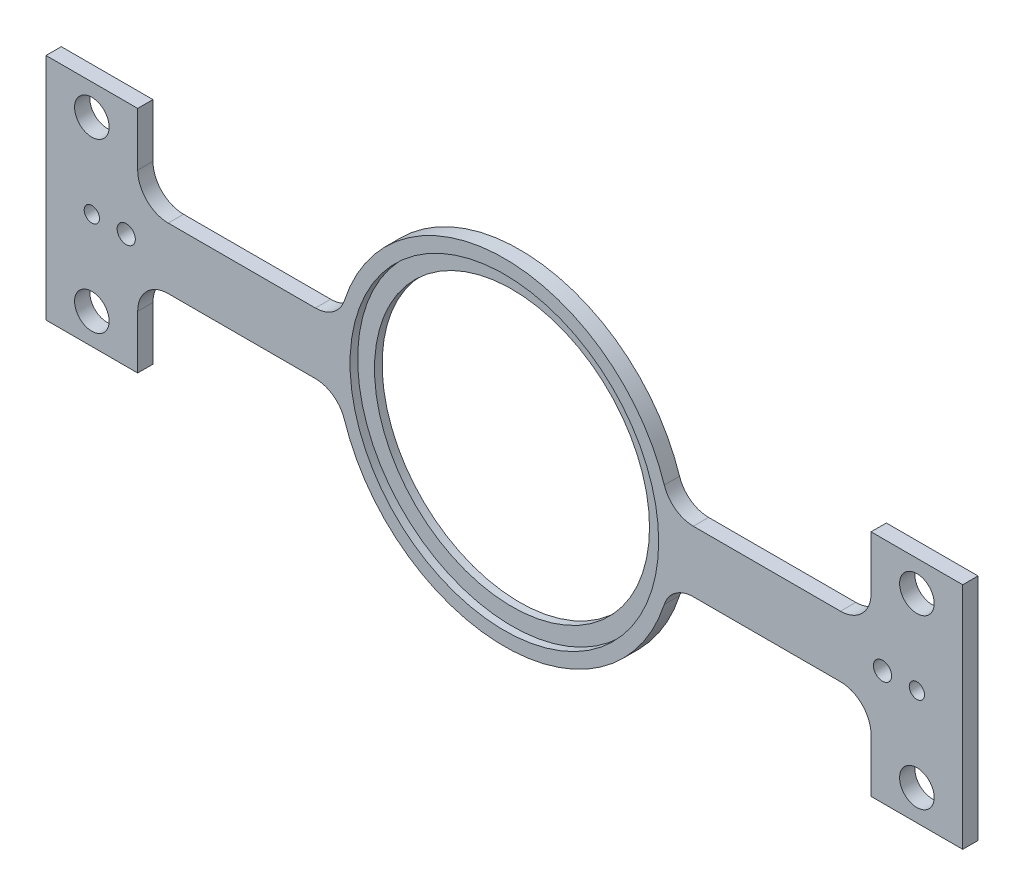
ISO-10303-21;
HEADER;
FILE_DESCRIPTION(('STEP AP214'),'2;1');
FILE_NAME('part.step','',(''),(''),'','','');
FILE_SCHEMA(('AUTOMOTIVE_DESIGN { 1 0 10303 214 1 1 1 1 }'));
ENDSEC;
DATA;
#1=APPLICATION_CONTEXT('core data for automotive mechanical design processes');
#2=APPLICATION_PROTOCOL_DEFINITION('international standard','automotive_design',2000,#1);
#3=PRODUCT_CONTEXT('',#1,'mechanical');
#4=PRODUCT('Part','Part','',(#3));
#5=PRODUCT_RELATED_PRODUCT_CATEGORY('part','',(#4));
#6=PRODUCT_DEFINITION_FORMATION('','',#4);
#7=PRODUCT_DEFINITION_CONTEXT('part definition',#1,'design');
#8=PRODUCT_DEFINITION('design','',#6,#7);
#9=PRODUCT_DEFINITION_SHAPE('','',#8);
#10=(LENGTH_UNIT() NAMED_UNIT(*) SI_UNIT(.MILLI.,.METRE.));
#11=(NAMED_UNIT(*) PLANE_ANGLE_UNIT() SI_UNIT($,.RADIAN.));
#12=(NAMED_UNIT(*) SI_UNIT($,.STERADIAN.) SOLID_ANGLE_UNIT());
#13=UNCERTAINTY_MEASURE_WITH_UNIT(LENGTH_MEASURE(1.E-05),#10,'distance_accuracy_value','');
#14=(GEOMETRIC_REPRESENTATION_CONTEXT(3) GLOBAL_UNCERTAINTY_ASSIGNED_CONTEXT((#13)) GLOBAL_UNIT_ASSIGNED_CONTEXT((#10,
#11,#12)) REPRESENTATION_CONTEXT('',''));
#15=CARTESIAN_POINT('',(0.,0.,0.));
#16=DIRECTION('',(0.,0.,1.));
#17=DIRECTION('',(1.,0.,0.));
#18=AXIS2_PLACEMENT_3D('',#15,#16,#17);
#19=CARTESIAN_POINT('',(0.,0.,1.));
#20=DIRECTION('',(0.,0.,-1.));
#21=DIRECTION('',(-1.,0.,0.));
#22=AXIS2_PLACEMENT_3D('',#19,#20,#21);
#23=CYLINDRICAL_SURFACE('',#22,9.);
#24=CARTESIAN_POINT('',(0.,0.,0.));
#25=DIRECTION('',(0.,0.,1.));
#26=DIRECTION('',(1.,0.,0.));
#27=AXIS2_PLACEMENT_3D('',#24,#25,#26);
#28=CIRCLE('',#27,9.);
#29=CARTESIAN_POINT('',(9.,0.,0.));
#30=VERTEX_POINT('',#29);
#31=EDGE_CURVE('E249',#30,#30,#28,.T.);
#32=ORIENTED_EDGE('',*,*,#31,.F.);
#33=EDGE_LOOP('',(#32));
#34=FACE_BOUND('',#33,.T.);
#35=CARTESIAN_POINT('',(0.,0.,0.5));
#36=DIRECTION('',(0.,0.,1.));
#37=DIRECTION('',(1.,0.,0.));
#38=AXIS2_PLACEMENT_3D('',#35,#36,#37);
#39=CIRCLE('',#38,9.);
#40=CARTESIAN_POINT('',(9.,0.,0.5));
#41=VERTEX_POINT('',#40);
#42=EDGE_CURVE('E246',#41,#41,#39,.T.);
#43=ORIENTED_EDGE('',*,*,#42,.T.);
#44=EDGE_LOOP('',(#43));
#45=FACE_BOUND('',#44,.T.);
#46=ADVANCED_FACE('F43',(#34,#45),#23,.F.);
#47=CARTESIAN_POINT('',(0.,0.,1.));
#48=DIRECTION('',(0.,0.,1.));
#49=DIRECTION('',(1.,0.,0.));
#50=AXIS2_PLACEMENT_3D('',#47,#48,#49);
#51=PLANE('',#50);
#52=CARTESIAN_POINT('',(24.75,0.,1.));
#53=DIRECTION('',(0.,0.,-1.));
#54=DIRECTION('',(-1.,0.,0.));
#55=AXIS2_PLACEMENT_3D('',#52,#53,#54);
#56=CIRCLE('',#55,0.59563);
#57=CARTESIAN_POINT('',(24.15437,0.,1.));
#58=VERTEX_POINT('',#57);
#59=EDGE_CURVE('E565',#58,#58,#56,.T.);
#60=ORIENTED_EDGE('',*,*,#59,.T.);
#61=EDGE_LOOP('',(#60));
#62=FACE_BOUND('',#61,.T.);
#63=CARTESIAN_POINT('',(-24.75,0.,1.));
#64=DIRECTION('',(0.,0.,-1.));
#65=DIRECTION('',(-1.,0.,0.));
#66=AXIS2_PLACEMENT_3D('',#63,#64,#65);
#67=CIRCLE('',#66,0.59563);
#68=CARTESIAN_POINT('',(-25.34563,0.,1.));
#69=VERTEX_POINT('',#68);
#70=EDGE_CURVE('E557',#69,#69,#67,.T.);
#71=ORIENTED_EDGE('',*,*,#70,.T.);
#72=EDGE_LOOP('',(#71));
#73=FACE_BOUND('',#72,.T.);
#74=CARTESIAN_POINT('',(27.,-5.5,1.));
#75=DIRECTION('',(0.,0.,-1.));
#76=DIRECTION('',(-1.,0.,0.));
#77=AXIS2_PLACEMENT_3D('',#74,#75,#76);
#78=CIRCLE('',#77,1.1303);
#79=CARTESIAN_POINT('',(25.8697,-5.5,1.));
#80=VERTEX_POINT('',#79);
#81=EDGE_CURVE('E549',#80,#80,#78,.T.);
#82=ORIENTED_EDGE('',*,*,#81,.T.);
#83=EDGE_LOOP('',(#82));
#84=FACE_BOUND('',#83,.T.);
#85=CARTESIAN_POINT('',(27.,5.5,1.));
#86=DIRECTION('',(0.,0.,-1.));
#87=DIRECTION('',(-1.,0.,0.));
#88=AXIS2_PLACEMENT_3D('',#85,#86,#87);
#89=CIRCLE('',#88,1.1303);
#90=CARTESIAN_POINT('',(25.8697,5.5,1.));
#91=VERTEX_POINT('',#90);
#92=EDGE_CURVE('E541',#91,#91,#89,.T.);
#93=ORIENTED_EDGE('',*,*,#92,.T.);
#94=EDGE_LOOP('',(#93));
#95=FACE_BOUND('',#94,.T.);
#96=CARTESIAN_POINT('',(-27.,5.5,1.));
#97=DIRECTION('',(0.,0.,-1.));
#98=DIRECTION('',(-1.,0.,0.));
#99=AXIS2_PLACEMENT_3D('',#96,#97,#98);
#100=CIRCLE('',#99,1.1303);
#101=CARTESIAN_POINT('',(-28.1303,5.5,1.));
#102=VERTEX_POINT('',#101);
#103=EDGE_CURVE('E533',#102,#102,#100,.T.);
#104=ORIENTED_EDGE('',*,*,#103,.T.);
#105=EDGE_LOOP('',(#104));
#106=FACE_BOUND('',#105,.T.);
#107=CARTESIAN_POINT('',(-27.,-5.5,1.));
#108=DIRECTION('',(0.,0.,-1.));
#109=DIRECTION('',(-1.,0.,0.));
#110=AXIS2_PLACEMENT_3D('',#107,#108,#109);
#111=CIRCLE('',#110,1.1303);
#112=CARTESIAN_POINT('',(-28.1303,-5.5,1.));
#113=VERTEX_POINT('',#112);
#114=EDGE_CURVE('E515',#113,#113,#111,.T.);
#115=ORIENTED_EDGE('',*,*,#114,.T.);
#116=EDGE_LOOP('',(#115));
#117=FACE_BOUND('',#116,.T.);
#118=CARTESIAN_POINT('',(27.,0.,1.));
#119=DIRECTION('',(0.,0.,-1.));
#120=DIRECTION('',(-1.,0.,0.));
#121=AXIS2_PLACEMENT_3D('',#118,#119,#120);
#122=CIRCLE('',#121,0.499999999999999);
#123=CARTESIAN_POINT('',(26.5,0.,1.));
#124=VERTEX_POINT('',#123);
#125=EDGE_CURVE('E506',#124,#124,#122,.T.);
#126=ORIENTED_EDGE('',*,*,#125,.T.);
#127=EDGE_LOOP('',(#126));
#128=FACE_BOUND('',#127,.T.);
#129=CARTESIAN_POINT('',(-27.,0.,1.));
#130=DIRECTION('',(0.,0.,-1.));
#131=DIRECTION('',(-1.,0.,0.));
#132=AXIS2_PLACEMENT_3D('',#129,#130,#131);
#133=CIRCLE('',#132,0.499999999999999);
#134=CARTESIAN_POINT('',(-27.5,0.,1.));
#135=VERTEX_POINT('',#134);
#136=EDGE_CURVE('E514',#135,#135,#133,.T.);
#137=ORIENTED_EDGE('',*,*,#136,.T.);
#138=EDGE_LOOP('',(#137));
#139=FACE_BOUND('',#138,.T.);
#140=CARTESIAN_POINT('',(0.,0.,1.));
#141=DIRECTION('',(0.,0.,1.));
#142=DIRECTION('',(1.,0.,0.));
#143=AXIS2_PLACEMENT_3D('',#140,#141,#142);
#144=CIRCLE('',#143,10.1);
#145=CARTESIAN_POINT('',(10.1,0.,1.));
#146=VERTEX_POINT('',#145);
#147=EDGE_CURVE('E502',#146,#146,#144,.T.);
#148=ORIENTED_EDGE('',*,*,#147,.F.);
#149=EDGE_LOOP('',(#148));
#150=FACE_BOUND('',#149,.T.);
#151=DIRECTION('',(0.,-1.,0.));
#152=VECTOR('',#151,1.);
#153=CARTESIAN_POINT('',(-30.,7.5,1.));
#154=LINE('',#153,#152);
#155=CARTESIAN_POINT('',(-30.,7.5,1.));
#156=VERTEX_POINT('',#155);
#157=CARTESIAN_POINT('',(-30.,-7.5,1.));
#158=VERTEX_POINT('',#157);
#159=EDGE_CURVE('E219',#156,#158,#154,.T.);
#160=ORIENTED_EDGE('',*,*,#159,.T.);
#161=DIRECTION('',(1.,0.,0.));
#162=VECTOR('',#161,1.);
#163=CARTESIAN_POINT('',(-30.,-7.5,1.));
#164=LINE('',#163,#162);
#165=CARTESIAN_POINT('',(-24.,-7.5,1.));
#166=VERTEX_POINT('',#165);
#167=EDGE_CURVE('E206',#158,#166,#164,.T.);
#168=ORIENTED_EDGE('',*,*,#167,.T.);
#169=DIRECTION('',(0.,1.,0.));
#170=VECTOR('',#169,1.);
#171=CARTESIAN_POINT('',(-24.,-7.5,1.));
#172=LINE('',#171,#170);
#173=CARTESIAN_POINT('',(-24.,-4.,1.));
#174=VERTEX_POINT('',#173);
#175=EDGE_CURVE('E218',#166,#174,#172,.T.);
#176=ORIENTED_EDGE('',*,*,#175,.T.);
#177=CARTESIAN_POINT('',(-22.,-4.,1.));
#178=DIRECTION('',(0.,0.,1.));
#179=DIRECTION('',(1.,0.,0.));
#180=AXIS2_PLACEMENT_3D('',#177,#178,#179);
#181=CIRCLE('',#180,2.);
#182=CARTESIAN_POINT('',(-22.,-2.,1.));
#183=VERTEX_POINT('',#182);
#184=EDGE_CURVE('E311',#174,#183,#181,.F.);
#185=ORIENTED_EDGE('',*,*,#184,.T.);
#186=DIRECTION('',(1.,0.,0.));
#187=VECTOR('',#186,1.);
#188=CARTESIAN_POINT('',(-24.,-2.,1.));
#189=LINE('',#188,#187);
#190=CARTESIAN_POINT('',(-12.369316876853,-2.,1.));
#191=VERTEX_POINT('',#190);
#192=EDGE_CURVE('E493',#183,#191,#189,.T.);
#193=ORIENTED_EDGE('',*,*,#192,.T.);
#194=CARTESIAN_POINT('',(-12.369316876853,-4.,1.));
#195=DIRECTION('',(0.,0.,1.));
#196=DIRECTION('',(1.,0.,0.));
#197=AXIS2_PLACEMENT_3D('',#194,#195,#196);
#198=CIRCLE('',#197,2.);
#199=CARTESIAN_POINT('',(-10.4663450496448,-3.38461538461539,1.));
#200=VERTEX_POINT('',#199);
#201=EDGE_CURVE('E317',#191,#200,#198,.F.);
#202=ORIENTED_EDGE('',*,*,#201,.T.);
#203=CARTESIAN_POINT('',(0.,0.,1.));
#204=DIRECTION('',(0.,0.,1.));
#205=DIRECTION('',(1.,0.,0.));
#206=AXIS2_PLACEMENT_3D('',#203,#204,#205);
#207=CIRCLE('',#206,11.);
#208=CARTESIAN_POINT('',(10.4663450496448,-3.38461538461539,1.));
#209=VERTEX_POINT('',#208);
#210=EDGE_CURVE('E489',#200,#209,#207,.T.);
#211=ORIENTED_EDGE('',*,*,#210,.T.);
#212=CARTESIAN_POINT('',(12.369316876853,-4.,1.));
#213=DIRECTION('',(0.,0.,1.));
#214=DIRECTION('',(1.,0.,0.));
#215=AXIS2_PLACEMENT_3D('',#212,#213,#214);
#216=CIRCLE('',#215,2.);
#217=CARTESIAN_POINT('',(12.369316876853,-2.,1.));
#218=VERTEX_POINT('',#217);
#219=EDGE_CURVE('E323',#209,#218,#216,.F.);
#220=ORIENTED_EDGE('',*,*,#219,.T.);
#221=DIRECTION('',(1.,0.,0.));
#222=VECTOR('',#221,1.);
#223=CARTESIAN_POINT('',(24.,-2.,1.));
#224=LINE('',#223,#222);
#225=CARTESIAN_POINT('',(22.,-2.,1.));
#226=VERTEX_POINT('',#225);
#227=EDGE_CURVE('E485',#218,#226,#224,.T.);
#228=ORIENTED_EDGE('',*,*,#227,.T.);
#229=CARTESIAN_POINT('',(22.,-4.,1.));
#230=DIRECTION('',(0.,0.,1.));
#231=DIRECTION('',(1.,0.,0.));
#232=AXIS2_PLACEMENT_3D('',#229,#230,#231);
#233=CIRCLE('',#232,2.);
#234=CARTESIAN_POINT('',(24.,-4.,1.));
#235=VERTEX_POINT('',#234);
#236=EDGE_CURVE('E329',#226,#235,#233,.F.);
#237=ORIENTED_EDGE('',*,*,#236,.T.);
#238=DIRECTION('',(0.,-1.,0.));
#239=VECTOR('',#238,1.);
#240=CARTESIAN_POINT('',(24.,-7.5,1.));
#241=LINE('',#240,#239);
#242=CARTESIAN_POINT('',(24.,-7.5,1.));
#243=VERTEX_POINT('',#242);
#244=EDGE_CURVE('E482',#235,#243,#241,.T.);
#245=ORIENTED_EDGE('',*,*,#244,.T.);
#246=DIRECTION('',(1.,0.,0.));
#247=VECTOR('',#246,1.);
#248=CARTESIAN_POINT('',(30.,-7.5,1.));
#249=LINE('',#248,#247);
#250=CARTESIAN_POINT('',(30.,-7.5,1.));
#251=VERTEX_POINT('',#250);
#252=EDGE_CURVE('E458',#243,#251,#249,.T.);
#253=ORIENTED_EDGE('',*,*,#252,.T.);
#254=DIRECTION('',(0.,1.,0.));
#255=VECTOR('',#254,1.);
#256=CARTESIAN_POINT('',(30.,7.5,1.));
#257=LINE('',#256,#255);
#258=CARTESIAN_POINT('',(30.,7.5,1.));
#259=VERTEX_POINT('',#258);
#260=EDGE_CURVE('E474',#251,#259,#257,.T.);
#261=ORIENTED_EDGE('',*,*,#260,.T.);
#262=DIRECTION('',(-1.,0.,0.));
#263=VECTOR('',#262,1.);
#264=CARTESIAN_POINT('',(24.,7.5,1.));
#265=LINE('',#264,#263);
#266=CARTESIAN_POINT('',(24.,7.5,1.));
#267=VERTEX_POINT('',#266);
#268=EDGE_CURVE('E472',#259,#267,#265,.T.);
#269=ORIENTED_EDGE('',*,*,#268,.T.);
#270=DIRECTION('',(0.,-1.,0.));
#271=VECTOR('',#270,1.);
#272=CARTESIAN_POINT('',(24.,2.,1.));
#273=LINE('',#272,#271);
#274=CARTESIAN_POINT('',(24.,4.,1.));
#275=VERTEX_POINT('',#274);
#276=EDGE_CURVE('E378',#267,#275,#273,.T.);
#277=ORIENTED_EDGE('',*,*,#276,.T.);
#278=CARTESIAN_POINT('',(22.,4.,1.));
#279=DIRECTION('',(0.,0.,1.));
#280=DIRECTION('',(1.,0.,0.));
#281=AXIS2_PLACEMENT_3D('',#278,#279,#280);
#282=CIRCLE('',#281,2.);
#283=CARTESIAN_POINT('',(22.,2.,1.));
#284=VERTEX_POINT('',#283);
#285=EDGE_CURVE('E340',#275,#284,#282,.F.);
#286=ORIENTED_EDGE('',*,*,#285,.T.);
#287=DIRECTION('',(-1.,0.,0.));
#288=VECTOR('',#287,1.);
#289=CARTESIAN_POINT('',(10.816653826392,2.,1.));
#290=LINE('',#289,#288);
#291=CARTESIAN_POINT('',(12.369316876853,2.,1.));
#292=VERTEX_POINT('',#291);
#293=EDGE_CURVE('E366',#284,#292,#290,.T.);
#294=ORIENTED_EDGE('',*,*,#293,.T.);
#295=CARTESIAN_POINT('',(12.369316876853,4.,1.));
#296=DIRECTION('',(0.,0.,1.));
#297=DIRECTION('',(1.,0.,0.));
#298=AXIS2_PLACEMENT_3D('',#295,#296,#297);
#299=CIRCLE('',#298,2.);
#300=CARTESIAN_POINT('',(10.4663450496448,3.38461538461538,1.));
#301=VERTEX_POINT('',#300);
#302=EDGE_CURVE('E11',#292,#301,#299,.F.);
#303=ORIENTED_EDGE('',*,*,#302,.T.);
#304=CARTESIAN_POINT('',(0.,0.,1.));
#305=DIRECTION('',(0.,0.,1.));
#306=DIRECTION('',(1.,0.,0.));
#307=AXIS2_PLACEMENT_3D('',#304,#305,#306);
#308=CIRCLE('',#307,11.);
#309=CARTESIAN_POINT('',(-10.4663450496448,3.38461538461538,1.));
#310=VERTEX_POINT('',#309);
#311=EDGE_CURVE('E364',#301,#310,#308,.T.);
#312=ORIENTED_EDGE('',*,*,#311,.T.);
#313=CARTESIAN_POINT('',(-12.369316876853,4.,1.));
#314=DIRECTION('',(0.,0.,1.));
#315=DIRECTION('',(1.,0.,0.));
#316=AXIS2_PLACEMENT_3D('',#313,#314,#315);
#317=CIRCLE('',#316,2.);
#318=CARTESIAN_POINT('',(-12.369316876853,2.,1.));
#319=VERTEX_POINT('',#318);
#320=EDGE_CURVE('E335',#310,#319,#317,.F.);
#321=ORIENTED_EDGE('',*,*,#320,.T.);
#322=DIRECTION('',(-1.,0.,0.));
#323=VECTOR('',#322,1.);
#324=CARTESIAN_POINT('',(-10.816653826392,2.,1.));
#325=LINE('',#324,#323);
#326=CARTESIAN_POINT('',(-22.,2.,1.));
#327=VERTEX_POINT('',#326);
#328=EDGE_CURVE('E371',#319,#327,#325,.T.);
#329=ORIENTED_EDGE('',*,*,#328,.T.);
#330=CARTESIAN_POINT('',(-22.,4.,1.));
#331=DIRECTION('',(0.,0.,1.));
#332=DIRECTION('',(1.,0.,0.));
#333=AXIS2_PLACEMENT_3D('',#330,#331,#332);
#334=CIRCLE('',#333,2.);
#335=CARTESIAN_POINT('',(-24.,4.,1.));
#336=VERTEX_POINT('',#335);
#337=EDGE_CURVE('E305',#327,#336,#334,.F.);
#338=ORIENTED_EDGE('',*,*,#337,.T.);
#339=DIRECTION('',(0.,1.,0.));
#340=VECTOR('',#339,1.);
#341=CARTESIAN_POINT('',(-24.,2.,1.));
#342=LINE('',#341,#340);
#343=CARTESIAN_POINT('',(-24.,7.5,1.));
#344=VERTEX_POINT('',#343);
#345=EDGE_CURVE('E376',#336,#344,#342,.T.);
#346=ORIENTED_EDGE('',*,*,#345,.T.);
#347=DIRECTION('',(-1.,0.,0.));
#348=VECTOR('',#347,1.);
#349=CARTESIAN_POINT('',(-24.,7.5,1.));
#350=LINE('',#349,#348);
#351=EDGE_CURVE('E224',#344,#156,#350,.T.);
#352=ORIENTED_EDGE('',*,*,#351,.T.);
#353=EDGE_LOOP('',(#160,#168,#176,#185,#193,#202,#211,#220,#228,#237,#245,#253,#261,#269,#277,
#286,#294,#303,#312,#321,#329,#338,#346,#352));
#354=FACE_BOUND('',#353,.T.);
#355=ADVANCED_FACE('F222',(#62,#73,#84,#95,#106,#117,#128,#139,#150,#354),#51,.T.);
#356=CARTESIAN_POINT('',(0.,0.,0.));
#357=DIRECTION('',(0.,0.,1.));
#358=DIRECTION('',(1.,0.,0.));
#359=AXIS2_PLACEMENT_3D('',#356,#357,#358);
#360=PLANE('',#359);
#361=CARTESIAN_POINT('',(24.75,0.,0.));
#362=DIRECTION('',(0.,0.,-1.));
#363=DIRECTION('',(-1.,0.,0.));
#364=AXIS2_PLACEMENT_3D('',#361,#362,#363);
#365=CIRCLE('',#364,0.59563);
#366=CARTESIAN_POINT('',(24.15437,0.,0.));
#367=VERTEX_POINT('',#366);
#368=EDGE_CURVE('E569',#367,#367,#365,.T.);
#369=ORIENTED_EDGE('',*,*,#368,.F.);
#370=EDGE_LOOP('',(#369));
#371=FACE_BOUND('',#370,.T.);
#372=CARTESIAN_POINT('',(-24.75,0.,0.));
#373=DIRECTION('',(0.,0.,-1.));
#374=DIRECTION('',(-1.,0.,0.));
#375=AXIS2_PLACEMENT_3D('',#372,#373,#374);
#376=CIRCLE('',#375,0.59563);
#377=CARTESIAN_POINT('',(-25.34563,0.,0.));
#378=VERTEX_POINT('',#377);
#379=EDGE_CURVE('E561',#378,#378,#376,.T.);
#380=ORIENTED_EDGE('',*,*,#379,.F.);
#381=EDGE_LOOP('',(#380));
#382=FACE_BOUND('',#381,.T.);
#383=CARTESIAN_POINT('',(27.,-5.5,0.));
#384=DIRECTION('',(0.,0.,-1.));
#385=DIRECTION('',(-1.,0.,0.));
#386=AXIS2_PLACEMENT_3D('',#383,#384,#385);
#387=CIRCLE('',#386,1.1303);
#388=CARTESIAN_POINT('',(25.8697,-5.5,0.));
#389=VERTEX_POINT('',#388);
#390=EDGE_CURVE('E553',#389,#389,#387,.T.);
#391=ORIENTED_EDGE('',*,*,#390,.F.);
#392=EDGE_LOOP('',(#391));
#393=FACE_BOUND('',#392,.T.);
#394=CARTESIAN_POINT('',(27.,5.5,0.));
#395=DIRECTION('',(0.,0.,-1.));
#396=DIRECTION('',(-1.,0.,0.));
#397=AXIS2_PLACEMENT_3D('',#394,#395,#396);
#398=CIRCLE('',#397,1.1303);
#399=CARTESIAN_POINT('',(25.8697,5.5,0.));
#400=VERTEX_POINT('',#399);
#401=EDGE_CURVE('E545',#400,#400,#398,.T.);
#402=ORIENTED_EDGE('',*,*,#401,.F.);
#403=EDGE_LOOP('',(#402));
#404=FACE_BOUND('',#403,.T.);
#405=CARTESIAN_POINT('',(-27.,5.5,0.));
#406=DIRECTION('',(0.,0.,-1.));
#407=DIRECTION('',(-1.,0.,0.));
#408=AXIS2_PLACEMENT_3D('',#405,#406,#407);
#409=CIRCLE('',#408,1.1303);
#410=CARTESIAN_POINT('',(-28.1303,5.5,0.));
#411=VERTEX_POINT('',#410);
#412=EDGE_CURVE('E537',#411,#411,#409,.T.);
#413=ORIENTED_EDGE('',*,*,#412,.F.);
#414=EDGE_LOOP('',(#413));
#415=FACE_BOUND('',#414,.T.);
#416=CARTESIAN_POINT('',(-27.,-5.5,0.));
#417=DIRECTION('',(0.,0.,-1.));
#418=DIRECTION('',(-1.,0.,0.));
#419=AXIS2_PLACEMENT_3D('',#416,#417,#418);
#420=CIRCLE('',#419,1.1303);
#421=CARTESIAN_POINT('',(-28.1303,-5.5,0.));
#422=VERTEX_POINT('',#421);
#423=EDGE_CURVE('E529',#422,#422,#420,.T.);
#424=ORIENTED_EDGE('',*,*,#423,.F.);
#425=EDGE_LOOP('',(#424));
#426=FACE_BOUND('',#425,.T.);
#427=CARTESIAN_POINT('',(27.,0.,0.));
#428=DIRECTION('',(0.,0.,-1.));
#429=DIRECTION('',(-1.,0.,0.));
#430=AXIS2_PLACEMENT_3D('',#427,#428,#429);
#431=CIRCLE('',#430,0.499999999999999);
#432=CARTESIAN_POINT('',(26.5,0.,0.));
#433=VERTEX_POINT('',#432);
#434=EDGE_CURVE('E519',#433,#433,#431,.T.);
#435=ORIENTED_EDGE('',*,*,#434,.F.);
#436=EDGE_LOOP('',(#435));
#437=FACE_BOUND('',#436,.T.);
#438=CARTESIAN_POINT('',(-27.,0.,0.));
#439=DIRECTION('',(0.,0.,-1.));
#440=DIRECTION('',(-1.,0.,0.));
#441=AXIS2_PLACEMENT_3D('',#438,#439,#440);
#442=CIRCLE('',#441,0.499999999999999);
#443=CARTESIAN_POINT('',(-27.5,0.,0.));
#444=VERTEX_POINT('',#443);
#445=EDGE_CURVE('E510',#444,#444,#442,.T.);
#446=ORIENTED_EDGE('',*,*,#445,.F.);
#447=EDGE_LOOP('',(#446));
#448=FACE_BOUND('',#447,.T.);
#449=DIRECTION('',(0.,-1.,0.));
#450=VECTOR('',#449,1.);
#451=CARTESIAN_POINT('',(-30.,7.5,0.));
#452=LINE('',#451,#450);
#453=CARTESIAN_POINT('',(-30.,7.5,0.));
#454=VERTEX_POINT('',#453);
#455=CARTESIAN_POINT('',(-30.,-7.5,0.));
#456=VERTEX_POINT('',#455);
#457=EDGE_CURVE('E233',#454,#456,#452,.T.);
#458=ORIENTED_EDGE('',*,*,#457,.F.);
#459=DIRECTION('',(-1.,0.,0.));
#460=VECTOR('',#459,1.);
#461=CARTESIAN_POINT('',(-24.,7.5,0.));
#462=LINE('',#461,#460);
#463=CARTESIAN_POINT('',(-24.,7.5,0.));
#464=VERTEX_POINT('',#463);
#465=EDGE_CURVE('E229',#464,#454,#462,.T.);
#466=ORIENTED_EDGE('',*,*,#465,.F.);
#467=DIRECTION('',(0.,1.,0.));
#468=VECTOR('',#467,1.);
#469=CARTESIAN_POINT('',(-24.,2.,0.));
#470=LINE('',#469,#468);
#471=CARTESIAN_POINT('',(-24.,4.,0.));
#472=VERTEX_POINT('',#471);
#473=EDGE_CURVE('E428',#472,#464,#470,.T.);
#474=ORIENTED_EDGE('',*,*,#473,.F.);
#475=CARTESIAN_POINT('',(-22.,4.,0.));
#476=DIRECTION('',(0.,0.,1.));
#477=DIRECTION('',(1.,0.,0.));
#478=AXIS2_PLACEMENT_3D('',#475,#476,#477);
#479=CIRCLE('',#478,2.);
#480=CARTESIAN_POINT('',(-22.,2.,0.));
#481=VERTEX_POINT('',#480);
#482=EDGE_CURVE('E302',#472,#481,#479,.T.);
#483=ORIENTED_EDGE('',*,*,#482,.T.);
#484=DIRECTION('',(-1.,0.,0.));
#485=VECTOR('',#484,1.);
#486=CARTESIAN_POINT('',(-10.816653826392,2.,0.));
#487=LINE('',#486,#485);
#488=CARTESIAN_POINT('',(-12.369316876853,2.,0.));
#489=VERTEX_POINT('',#488);
#490=EDGE_CURVE('E424',#489,#481,#487,.T.);
#491=ORIENTED_EDGE('',*,*,#490,.F.);
#492=CARTESIAN_POINT('',(-12.369316876853,4.,0.));
#493=DIRECTION('',(0.,0.,1.));
#494=DIRECTION('',(1.,0.,0.));
#495=AXIS2_PLACEMENT_3D('',#492,#493,#494);
#496=CIRCLE('',#495,2.);
#497=CARTESIAN_POINT('',(-10.4663450496448,3.38461538461538,0.));
#498=VERTEX_POINT('',#497);
#499=EDGE_CURVE('E332',#489,#498,#496,.T.);
#500=ORIENTED_EDGE('',*,*,#499,.T.);
#501=CARTESIAN_POINT('',(0.,0.,0.));
#502=DIRECTION('',(0.,0.,1.));
#503=DIRECTION('',(1.,0.,0.));
#504=AXIS2_PLACEMENT_3D('',#501,#502,#503);
#505=CIRCLE('',#504,11.);
#506=CARTESIAN_POINT('',(10.4663450496448,3.38461538461538,0.));
#507=VERTEX_POINT('',#506);
#508=EDGE_CURVE('E349',#507,#498,#505,.T.);
#509=ORIENTED_EDGE('',*,*,#508,.F.);
#510=CARTESIAN_POINT('',(12.369316876853,4.,0.));
#511=DIRECTION('',(0.,0.,1.));
#512=DIRECTION('',(1.,0.,0.));
#513=AXIS2_PLACEMENT_3D('',#510,#511,#512);
#514=CIRCLE('',#513,2.);
#515=CARTESIAN_POINT('',(12.369316876853,2.,0.));
#516=VERTEX_POINT('',#515);
#517=EDGE_CURVE('E52',#507,#516,#514,.T.);
#518=ORIENTED_EDGE('',*,*,#517,.T.);
#519=DIRECTION('',(-1.,0.,0.));
#520=VECTOR('',#519,1.);
#521=CARTESIAN_POINT('',(10.816653826392,2.,0.));
#522=LINE('',#521,#520);
#523=CARTESIAN_POINT('',(22.,2.,0.));
#524=VERTEX_POINT('',#523);
#525=EDGE_CURVE('E347',#524,#516,#522,.T.);
#526=ORIENTED_EDGE('',*,*,#525,.F.);
#527=CARTESIAN_POINT('',(22.,4.,0.));
#528=DIRECTION('',(0.,0.,1.));
#529=DIRECTION('',(1.,0.,0.));
#530=AXIS2_PLACEMENT_3D('',#527,#528,#529);
#531=CIRCLE('',#530,2.);
#532=CARTESIAN_POINT('',(24.,4.,0.));
#533=VERTEX_POINT('',#532);
#534=EDGE_CURVE('E67',#524,#533,#531,.T.);
#535=ORIENTED_EDGE('',*,*,#534,.T.);
#536=DIRECTION('',(0.,-1.,0.));
#537=VECTOR('',#536,1.);
#538=CARTESIAN_POINT('',(24.,2.,0.));
#539=LINE('',#538,#537);
#540=CARTESIAN_POINT('',(24.,7.5,0.));
#541=VERTEX_POINT('',#540);
#542=EDGE_CURVE('E359',#541,#533,#539,.T.);
#543=ORIENTED_EDGE('',*,*,#542,.F.);
#544=DIRECTION('',(-1.,0.,0.));
#545=VECTOR('',#544,1.);
#546=CARTESIAN_POINT('',(24.,7.5,0.));
#547=LINE('',#546,#545);
#548=CARTESIAN_POINT('',(30.,7.5,0.));
#549=VERTEX_POINT('',#548);
#550=EDGE_CURVE('E417',#549,#541,#547,.T.);
#551=ORIENTED_EDGE('',*,*,#550,.F.);
#552=DIRECTION('',(0.,1.,0.));
#553=VECTOR('',#552,1.);
#554=CARTESIAN_POINT('',(30.,7.5,0.));
#555=LINE('',#554,#553);
#556=CARTESIAN_POINT('',(30.,-7.5,0.));
#557=VERTEX_POINT('',#556);
#558=EDGE_CURVE('E414',#557,#549,#555,.T.);
#559=ORIENTED_EDGE('',*,*,#558,.F.);
#560=DIRECTION('',(1.,0.,0.));
#561=VECTOR('',#560,1.);
#562=CARTESIAN_POINT('',(30.,-7.5,0.));
#563=LINE('',#562,#561);
#564=CARTESIAN_POINT('',(24.,-7.5,0.));
#565=VERTEX_POINT('',#564);
#566=EDGE_CURVE('E411',#565,#557,#563,.T.);
#567=ORIENTED_EDGE('',*,*,#566,.F.);
#568=DIRECTION('',(0.,-1.,0.));
#569=VECTOR('',#568,1.);
#570=CARTESIAN_POINT('',(24.,-7.5,0.));
#571=LINE('',#570,#569);
#572=CARTESIAN_POINT('',(24.,-4.,0.));
#573=VERTEX_POINT('',#572);
#574=EDGE_CURVE('E408',#573,#565,#571,.T.);
#575=ORIENTED_EDGE('',*,*,#574,.F.);
#576=CARTESIAN_POINT('',(22.,-4.,0.));
#577=DIRECTION('',(0.,0.,1.));
#578=DIRECTION('',(1.,0.,0.));
#579=AXIS2_PLACEMENT_3D('',#576,#577,#578);
#580=CIRCLE('',#579,2.);
#581=CARTESIAN_POINT('',(22.,-2.,0.));
#582=VERTEX_POINT('',#581);
#583=EDGE_CURVE('E326',#573,#582,#580,.T.);
#584=ORIENTED_EDGE('',*,*,#583,.T.);
#585=DIRECTION('',(1.,0.,0.));
#586=VECTOR('',#585,1.);
#587=CARTESIAN_POINT('',(24.,-2.,0.));
#588=LINE('',#587,#586);
#589=CARTESIAN_POINT('',(12.369316876853,-2.,0.));
#590=VERTEX_POINT('',#589);
#591=EDGE_CURVE('E404',#590,#582,#588,.T.);
#592=ORIENTED_EDGE('',*,*,#591,.F.);
#593=CARTESIAN_POINT('',(12.369316876853,-4.,0.));
#594=DIRECTION('',(0.,0.,1.));
#595=DIRECTION('',(1.,0.,0.));
#596=AXIS2_PLACEMENT_3D('',#593,#594,#595);
#597=CIRCLE('',#596,2.);
#598=CARTESIAN_POINT('',(10.4663450496448,-3.38461538461539,0.));
#599=VERTEX_POINT('',#598);
#600=EDGE_CURVE('E320',#590,#599,#597,.T.);
#601=ORIENTED_EDGE('',*,*,#600,.T.);
#602=CARTESIAN_POINT('',(0.,0.,0.));
#603=DIRECTION('',(0.,0.,1.));
#604=DIRECTION('',(1.,0.,0.));
#605=AXIS2_PLACEMENT_3D('',#602,#603,#604);
#606=CIRCLE('',#605,11.);
#607=CARTESIAN_POINT('',(-10.4663450496448,-3.38461538461539,0.));
#608=VERTEX_POINT('',#607);
#609=EDGE_CURVE('E400',#608,#599,#606,.T.);
#610=ORIENTED_EDGE('',*,*,#609,.F.);
#611=CARTESIAN_POINT('',(-12.369316876853,-4.,0.));
#612=DIRECTION('',(0.,0.,1.));
#613=DIRECTION('',(1.,0.,0.));
#614=AXIS2_PLACEMENT_3D('',#611,#612,#613);
#615=CIRCLE('',#614,2.);
#616=CARTESIAN_POINT('',(-12.369316876853,-2.,0.));
#617=VERTEX_POINT('',#616);
#618=EDGE_CURVE('E314',#608,#617,#615,.T.);
#619=ORIENTED_EDGE('',*,*,#618,.T.);
#620=DIRECTION('',(1.,0.,0.));
#621=VECTOR('',#620,1.);
#622=CARTESIAN_POINT('',(-24.,-2.,0.));
#623=LINE('',#622,#621);
#624=CARTESIAN_POINT('',(-22.,-2.,0.));
#625=VERTEX_POINT('',#624);
#626=EDGE_CURVE('E396',#625,#617,#623,.T.);
#627=ORIENTED_EDGE('',*,*,#626,.F.);
#628=CARTESIAN_POINT('',(-22.,-4.,0.));
#629=DIRECTION('',(0.,0.,1.));
#630=DIRECTION('',(1.,0.,0.));
#631=AXIS2_PLACEMENT_3D('',#628,#629,#630);
#632=CIRCLE('',#631,2.);
#633=CARTESIAN_POINT('',(-24.,-4.,0.));
#634=VERTEX_POINT('',#633);
#635=EDGE_CURVE('E308',#625,#634,#632,.T.);
#636=ORIENTED_EDGE('',*,*,#635,.T.);
#637=DIRECTION('',(0.,1.,0.));
#638=VECTOR('',#637,1.);
#639=CARTESIAN_POINT('',(-24.,-7.5,0.));
#640=LINE('',#639,#638);
#641=CARTESIAN_POINT('',(-24.,-7.5,0.));
#642=VERTEX_POINT('',#641);
#643=EDGE_CURVE('E392',#642,#634,#640,.T.);
#644=ORIENTED_EDGE('',*,*,#643,.F.);
#645=DIRECTION('',(1.,0.,0.));
#646=VECTOR('',#645,1.);
#647=CARTESIAN_POINT('',(-30.,-7.5,0.));
#648=LINE('',#647,#646);
#649=EDGE_CURVE('E389',#456,#642,#648,.T.);
#650=ORIENTED_EDGE('',*,*,#649,.F.);
#651=EDGE_LOOP('',(#458,#466,#474,#483,#491,#500,#509,#518,#526,#535,#543,#551,#559,#567,#575,
#584,#592,#601,#610,#619,#627,#636,#644,#650));
#652=FACE_BOUND('',#651,.T.);
#653=ORIENTED_EDGE('',*,*,#31,.T.);
#654=EDGE_LOOP('',(#653));
#655=FACE_BOUND('',#654,.T.);
#656=ADVANCED_FACE('F345',(#371,#382,#393,#404,#415,#426,#437,#448,#652,#655),#360,.F.);
#657=CARTESIAN_POINT('',(-30.,7.5,1.));
#658=DIRECTION('',(1.,0.,0.));
#659=DIRECTION('',(0.,0.,-1.));
#660=AXIS2_PLACEMENT_3D('',#657,#658,#659);
#661=PLANE('',#660);
#662=ORIENTED_EDGE('',*,*,#457,.T.);
#663=DIRECTION('',(0.,0.,-1.));
#664=VECTOR('',#663,1.);
#665=CARTESIAN_POINT('',(-30.,-7.5,1.));
#666=LINE('',#665,#664);
#667=EDGE_CURVE('E210',#158,#456,#666,.T.);
#668=ORIENTED_EDGE('',*,*,#667,.F.);
#669=ORIENTED_EDGE('',*,*,#159,.F.);
#670=DIRECTION('',(0.,0.,-1.));
#671=VECTOR('',#670,1.);
#672=CARTESIAN_POINT('',(-30.,7.5,1.));
#673=LINE('',#672,#671);
#674=EDGE_CURVE('E386',#156,#454,#673,.T.);
#675=ORIENTED_EDGE('',*,*,#674,.T.);
#676=EDGE_LOOP('',(#662,#668,#669,#675));
#677=FACE_BOUND('',#676,.T.);
#678=ADVANCED_FACE('F231',(#677),#661,.F.);
#679=CARTESIAN_POINT('',(-30.,-7.5,1.));
#680=DIRECTION('',(0.,1.,0.));
#681=DIRECTION('',(0.,0.,1.));
#682=AXIS2_PLACEMENT_3D('',#679,#680,#681);
#683=PLANE('',#682);
#684=ORIENTED_EDGE('',*,*,#649,.T.);
#685=DIRECTION('',(0.,0.,-1.));
#686=VECTOR('',#685,1.);
#687=CARTESIAN_POINT('',(-24.,-7.5,1.));
#688=LINE('',#687,#686);
#689=EDGE_CURVE('E213',#166,#642,#688,.T.);
#690=ORIENTED_EDGE('',*,*,#689,.F.);
#691=ORIENTED_EDGE('',*,*,#167,.F.);
#692=ORIENTED_EDGE('',*,*,#667,.T.);
#693=EDGE_LOOP('',(#684,#690,#691,#692));
#694=FACE_BOUND('',#693,.T.);
#695=ADVANCED_FACE('F208',(#694),#683,.F.);
#696=CARTESIAN_POINT('',(-24.,-7.5,1.));
#697=DIRECTION('',(-1.,0.,0.));
#698=DIRECTION('',(0.,0.,1.));
#699=AXIS2_PLACEMENT_3D('',#696,#697,#698);
#700=PLANE('',#699);
#701=ORIENTED_EDGE('',*,*,#643,.T.);
#702=DIRECTION('',(0.,0.,-1.));
#703=VECTOR('',#702,1.);
#704=CARTESIAN_POINT('',(-24.,-4.,1.));
#705=LINE('',#704,#703);
#706=EDGE_CURVE('E265',#634,#174,#705,.F.);
#707=ORIENTED_EDGE('',*,*,#706,.T.);
#708=ORIENTED_EDGE('',*,*,#175,.F.);
#709=ORIENTED_EDGE('',*,*,#689,.T.);
#710=EDGE_LOOP('',(#701,#707,#708,#709));
#711=FACE_BOUND('',#710,.T.);
#712=ADVANCED_FACE('F661',(#711),#700,.F.);
#713=CARTESIAN_POINT('',(-24.,-2.,1.));
#714=DIRECTION('',(0.,1.,0.));
#715=DIRECTION('',(-1.,0.,0.));
#716=AXIS2_PLACEMENT_3D('',#713,#714,#715);
#717=PLANE('',#716);
#718=ORIENTED_EDGE('',*,*,#192,.F.);
#719=DIRECTION('',(0.,0.,-1.));
#720=VECTOR('',#719,1.);
#721=CARTESIAN_POINT('',(-22.,-2.,0.));
#722=LINE('',#721,#720);
#723=EDGE_CURVE('E261',#183,#625,#722,.T.);
#724=ORIENTED_EDGE('',*,*,#723,.T.);
#725=ORIENTED_EDGE('',*,*,#626,.T.);
#726=DIRECTION('',(0.,0.,1.));
#727=VECTOR('',#726,1.);
#728=CARTESIAN_POINT('',(-12.369316876853,-2.,1.));
#729=LINE('',#728,#727);
#730=EDGE_CURVE('E258',#617,#191,#729,.T.);
#731=ORIENTED_EDGE('',*,*,#730,.T.);
#732=EDGE_LOOP('',(#718,#724,#725,#731));
#733=FACE_BOUND('',#732,.T.);
#734=ADVANCED_FACE('F657',(#733),#717,.F.);
#735=CARTESIAN_POINT('',(0.,0.,1.));
#736=DIRECTION('',(0.,0.,-1.));
#737=DIRECTION('',(-1.,0.,0.));
#738=AXIS2_PLACEMENT_3D('',#735,#736,#737);
#739=CYLINDRICAL_SURFACE('',#738,11.);
#740=ORIENTED_EDGE('',*,*,#210,.F.);
#741=DIRECTION('',(0.,0.,-1.));
#742=VECTOR('',#741,1.);
#743=CARTESIAN_POINT('',(-10.4663450496448,-3.38461538461539,1.));
#744=LINE('',#743,#742);
#745=EDGE_CURVE('E271',#200,#608,#744,.T.);
#746=ORIENTED_EDGE('',*,*,#745,.T.);
#747=ORIENTED_EDGE('',*,*,#609,.T.);
#748=DIRECTION('',(0.,0.,-1.));
#749=VECTOR('',#748,1.);
#750=CARTESIAN_POINT('',(10.4663450496448,-3.38461538461539,1.));
#751=LINE('',#750,#749);
#752=EDGE_CURVE('E268',#599,#209,#751,.F.);
#753=ORIENTED_EDGE('',*,*,#752,.T.);
#754=EDGE_LOOP('',(#740,#746,#747,#753));
#755=FACE_BOUND('',#754,.T.);
#756=ADVANCED_FACE('F653',(#755),#739,.T.);
#757=CARTESIAN_POINT('',(24.,-2.,1.));
#758=DIRECTION('',(0.,1.,0.));
#759=DIRECTION('',(-1.,0.,0.));
#760=AXIS2_PLACEMENT_3D('',#757,#758,#759);
#761=PLANE('',#760);
#762=ORIENTED_EDGE('',*,*,#227,.F.);
#763=DIRECTION('',(0.,0.,1.));
#764=VECTOR('',#763,1.);
#765=CARTESIAN_POINT('',(12.369316876853,-2.,0.));
#766=LINE('',#765,#764);
#767=EDGE_CURVE('E278',#218,#590,#766,.F.);
#768=ORIENTED_EDGE('',*,*,#767,.T.);
#769=ORIENTED_EDGE('',*,*,#591,.T.);
#770=DIRECTION('',(0.,0.,-1.));
#771=VECTOR('',#770,1.);
#772=CARTESIAN_POINT('',(22.,-2.,1.));
#773=LINE('',#772,#771);
#774=EDGE_CURVE('E275',#582,#226,#773,.F.);
#775=ORIENTED_EDGE('',*,*,#774,.T.);
#776=EDGE_LOOP('',(#762,#768,#769,#775));
#777=FACE_BOUND('',#776,.T.);
#778=ADVANCED_FACE('F650',(#777),#761,.F.);
#779=CARTESIAN_POINT('',(24.,-7.5,1.));
#780=DIRECTION('',(1.,0.,0.));
#781=DIRECTION('',(0.,0.,-1.));
#782=AXIS2_PLACEMENT_3D('',#779,#780,#781);
#783=PLANE('',#782);
#784=ORIENTED_EDGE('',*,*,#244,.F.);
#785=DIRECTION('',(0.,0.,-1.));
#786=VECTOR('',#785,1.);
#787=CARTESIAN_POINT('',(24.,-4.,0.));
#788=LINE('',#787,#786);
#789=EDGE_CURVE('E282',#235,#573,#788,.T.);
#790=ORIENTED_EDGE('',*,*,#789,.T.);
#791=ORIENTED_EDGE('',*,*,#574,.T.);
#792=DIRECTION('',(0.,0.,-1.));
#793=VECTOR('',#792,1.);
#794=CARTESIAN_POINT('',(24.,-7.5,1.));
#795=LINE('',#794,#793);
#796=EDGE_CURVE('E242',#243,#565,#795,.T.);
#797=ORIENTED_EDGE('',*,*,#796,.F.);
#798=EDGE_LOOP('',(#784,#790,#791,#797));
#799=FACE_BOUND('',#798,.T.);
#800=ADVANCED_FACE('F647',(#799),#783,.F.);
#801=CARTESIAN_POINT('',(30.,-7.5,1.));
#802=DIRECTION('',(0.,1.,0.));
#803=DIRECTION('',(0.,0.,1.));
#804=AXIS2_PLACEMENT_3D('',#801,#802,#803);
#805=PLANE('',#804);
#806=ORIENTED_EDGE('',*,*,#566,.T.);
#807=DIRECTION('',(0.,0.,-1.));
#808=VECTOR('',#807,1.);
#809=CARTESIAN_POINT('',(30.,-7.5,1.));
#810=LINE('',#809,#808);
#811=EDGE_CURVE('E447',#251,#557,#810,.T.);
#812=ORIENTED_EDGE('',*,*,#811,.F.);
#813=ORIENTED_EDGE('',*,*,#252,.F.);
#814=ORIENTED_EDGE('',*,*,#796,.T.);
#815=EDGE_LOOP('',(#806,#812,#813,#814));
#816=FACE_BOUND('',#815,.T.);
#817=ADVANCED_FACE('F456',(#816),#805,.F.);
#818=CARTESIAN_POINT('',(30.,7.5,1.));
#819=DIRECTION('',(-1.,0.,0.));
#820=DIRECTION('',(0.,0.,1.));
#821=AXIS2_PLACEMENT_3D('',#818,#819,#820);
#822=PLANE('',#821);
#823=ORIENTED_EDGE('',*,*,#558,.T.);
#824=DIRECTION('',(0.,0.,-1.));
#825=VECTOR('',#824,1.);
#826=CARTESIAN_POINT('',(30.,7.5,1.));
#827=LINE('',#826,#825);
#828=EDGE_CURVE('E443',#259,#549,#827,.T.);
#829=ORIENTED_EDGE('',*,*,#828,.F.);
#830=ORIENTED_EDGE('',*,*,#260,.F.);
#831=ORIENTED_EDGE('',*,*,#811,.T.);
#832=EDGE_LOOP('',(#823,#829,#830,#831));
#833=FACE_BOUND('',#832,.T.);
#834=ADVANCED_FACE('F466',(#833),#822,.F.);
#835=CARTESIAN_POINT('',(24.,7.5,1.));
#836=DIRECTION('',(0.,-1.,0.));
#837=DIRECTION('',(0.,0.,-1.));
#838=AXIS2_PLACEMENT_3D('',#835,#836,#837);
#839=PLANE('',#838);
#840=ORIENTED_EDGE('',*,*,#550,.T.);
#841=DIRECTION('',(0.,0.,-1.));
#842=VECTOR('',#841,1.);
#843=CARTESIAN_POINT('',(24.,7.5,1.));
#844=LINE('',#843,#842);
#845=EDGE_CURVE('E439',#267,#541,#844,.T.);
#846=ORIENTED_EDGE('',*,*,#845,.F.);
#847=ORIENTED_EDGE('',*,*,#268,.F.);
#848=ORIENTED_EDGE('',*,*,#828,.T.);
#849=EDGE_LOOP('',(#840,#846,#847,#848));
#850=FACE_BOUND('',#849,.T.);
#851=ADVANCED_FACE('F470',(#850),#839,.F.);
#852=CARTESIAN_POINT('',(24.,2.,1.));
#853=DIRECTION('',(1.,0.,0.));
#854=DIRECTION('',(0.,0.,-1.));
#855=AXIS2_PLACEMENT_3D('',#852,#853,#854);
#856=PLANE('',#855);
#857=ORIENTED_EDGE('',*,*,#542,.T.);
#858=DIRECTION('',(0.,0.,-1.));
#859=VECTOR('',#858,1.);
#860=CARTESIAN_POINT('',(24.,4.,1.));
#861=LINE('',#860,#859);
#862=EDGE_CURVE('E59',#533,#275,#861,.F.);
#863=ORIENTED_EDGE('',*,*,#862,.T.);
#864=ORIENTED_EDGE('',*,*,#276,.F.);
#865=ORIENTED_EDGE('',*,*,#845,.T.);
#866=EDGE_LOOP('',(#857,#863,#864,#865));
#867=FACE_BOUND('',#866,.T.);
#868=ADVANCED_FACE('F638',(#867),#856,.F.);
#869=CARTESIAN_POINT('',(10.816653826392,2.,1.));
#870=DIRECTION('',(0.,-1.,0.));
#871=DIRECTION('',(1.,0.,0.));
#872=AXIS2_PLACEMENT_3D('',#869,#870,#871);
#873=PLANE('',#872);
#874=ORIENTED_EDGE('',*,*,#293,.F.);
#875=DIRECTION('',(0.,0.,-1.));
#876=VECTOR('',#875,1.);
#877=CARTESIAN_POINT('',(22.,2.,0.));
#878=LINE('',#877,#876);
#879=EDGE_CURVE('E296',#284,#524,#878,.T.);
#880=ORIENTED_EDGE('',*,*,#879,.T.);
#881=ORIENTED_EDGE('',*,*,#525,.T.);
#882=DIRECTION('',(0.,0.,1.));
#883=VECTOR('',#882,1.);
#884=CARTESIAN_POINT('',(12.369316876853,2.,1.));
#885=LINE('',#884,#883);
#886=EDGE_CURVE('E293',#516,#292,#885,.T.);
#887=ORIENTED_EDGE('',*,*,#886,.T.);
#888=EDGE_LOOP('',(#874,#880,#881,#887));
#889=FACE_BOUND('',#888,.T.);
#890=ADVANCED_FACE('F355',(#889),#873,.F.);
#891=CARTESIAN_POINT('',(0.,0.,1.));
#892=DIRECTION('',(0.,0.,-1.));
#893=DIRECTION('',(-1.,0.,0.));
#894=AXIS2_PLACEMENT_3D('',#891,#892,#893);
#895=CYLINDRICAL_SURFACE('',#894,11.);
#896=ORIENTED_EDGE('',*,*,#508,.T.);
#897=DIRECTION('',(0.,0.,-1.));
#898=VECTOR('',#897,1.);
#899=CARTESIAN_POINT('',(-10.4663450496448,3.38461538461539,1.));
#900=LINE('',#899,#898);
#901=EDGE_CURVE('E290',#498,#310,#900,.F.);
#902=ORIENTED_EDGE('',*,*,#901,.T.);
#903=ORIENTED_EDGE('',*,*,#311,.F.);
#904=DIRECTION('',(0.,0.,-1.));
#905=VECTOR('',#904,1.);
#906=CARTESIAN_POINT('',(10.4663450496448,3.38461538461539,1.));
#907=LINE('',#906,#905);
#908=EDGE_CURVE('E286',#301,#507,#907,.T.);
#909=ORIENTED_EDGE('',*,*,#908,.T.);
#910=EDGE_LOOP('',(#896,#902,#903,#909));
#911=FACE_BOUND('',#910,.T.);
#912=ADVANCED_FACE('F368',(#911),#895,.T.);
#913=CARTESIAN_POINT('',(-10.816653826392,2.,1.));
#914=DIRECTION('',(0.,-1.,0.));
#915=DIRECTION('',(1.,0.,0.));
#916=AXIS2_PLACEMENT_3D('',#913,#914,#915);
#917=PLANE('',#916);
#918=ORIENTED_EDGE('',*,*,#490,.T.);
#919=DIRECTION('',(0.,0.,-1.));
#920=VECTOR('',#919,1.);
#921=CARTESIAN_POINT('',(-22.,2.,1.));
#922=LINE('',#921,#920);
#923=EDGE_CURVE('E255',#481,#327,#922,.F.);
#924=ORIENTED_EDGE('',*,*,#923,.T.);
#925=ORIENTED_EDGE('',*,*,#328,.F.);
#926=DIRECTION('',(0.,0.,1.));
#927=VECTOR('',#926,1.);
#928=CARTESIAN_POINT('',(-12.369316876853,2.,0.));
#929=LINE('',#928,#927);
#930=EDGE_CURVE('E240',#319,#489,#929,.F.);
#931=ORIENTED_EDGE('',*,*,#930,.T.);
#932=EDGE_LOOP('',(#918,#924,#925,#931));
#933=FACE_BOUND('',#932,.T.);
#934=ADVANCED_FACE('F629',(#933),#917,.F.);
#935=CARTESIAN_POINT('',(-24.,2.,1.));
#936=DIRECTION('',(-1.,0.,0.));
#937=DIRECTION('',(0.,0.,1.));
#938=AXIS2_PLACEMENT_3D('',#935,#936,#937);
#939=PLANE('',#938);
#940=ORIENTED_EDGE('',*,*,#345,.F.);
#941=DIRECTION('',(0.,0.,-1.));
#942=VECTOR('',#941,1.);
#943=CARTESIAN_POINT('',(-24.,4.,0.));
#944=LINE('',#943,#942);
#945=EDGE_CURVE('E235',#336,#472,#944,.T.);
#946=ORIENTED_EDGE('',*,*,#945,.T.);
#947=ORIENTED_EDGE('',*,*,#473,.T.);
#948=DIRECTION('',(0.,0.,-1.));
#949=VECTOR('',#948,1.);
#950=CARTESIAN_POINT('',(-24.,7.5,1.));
#951=LINE('',#950,#949);
#952=EDGE_CURVE('E435',#344,#464,#951,.T.);
#953=ORIENTED_EDGE('',*,*,#952,.F.);
#954=EDGE_LOOP('',(#940,#946,#947,#953));
#955=FACE_BOUND('',#954,.T.);
#956=ADVANCED_FACE('F625',(#955),#939,.F.);
#957=CARTESIAN_POINT('',(-24.,7.5,1.));
#958=DIRECTION('',(0.,-1.,0.));
#959=DIRECTION('',(0.,0.,-1.));
#960=AXIS2_PLACEMENT_3D('',#957,#958,#959);
#961=PLANE('',#960);
#962=ORIENTED_EDGE('',*,*,#465,.T.);
#963=ORIENTED_EDGE('',*,*,#674,.F.);
#964=ORIENTED_EDGE('',*,*,#351,.F.);
#965=ORIENTED_EDGE('',*,*,#952,.T.);
#966=EDGE_LOOP('',(#962,#963,#964,#965));
#967=FACE_BOUND('',#966,.T.);
#968=ADVANCED_FACE('F622',(#967),#961,.F.);
#969=CARTESIAN_POINT('',(0.,0.,0.5));
#970=DIRECTION('',(0.,0.,1.));
#971=DIRECTION('',(1.,0.,0.));
#972=AXIS2_PLACEMENT_3D('',#969,#970,#971);
#973=CYLINDRICAL_SURFACE('',#972,10.1);
#974=CARTESIAN_POINT('',(0.,0.,0.5));
#975=DIRECTION('',(0.,0.,1.));
#976=DIRECTION('',(1.,0.,0.));
#977=AXIS2_PLACEMENT_3D('',#974,#975,#976);
#978=CIRCLE('',#977,10.1);
#979=CARTESIAN_POINT('',(10.1,0.,0.5));
#980=VERTEX_POINT('',#979);
#981=EDGE_CURVE('E250',#980,#980,#978,.T.);
#982=ORIENTED_EDGE('',*,*,#981,.F.);
#983=EDGE_LOOP('',(#982));
#984=FACE_BOUND('',#983,.T.);
#985=ORIENTED_EDGE('',*,*,#147,.T.);
#986=EDGE_LOOP('',(#985));
#987=FACE_BOUND('',#986,.T.);
#988=ADVANCED_FACE('F606',(#984,#987),#973,.F.);
#989=CARTESIAN_POINT('',(0.,0.,0.5));
#990=DIRECTION('',(0.,0.,1.));
#991=DIRECTION('',(1.,0.,0.));
#992=AXIS2_PLACEMENT_3D('',#989,#990,#991);
#993=PLANE('',#992);
#994=ORIENTED_EDGE('',*,*,#42,.F.);
#995=EDGE_LOOP('',(#994));
#996=FACE_BOUND('',#995,.T.);
#997=ORIENTED_EDGE('',*,*,#981,.T.);
#998=EDGE_LOOP('',(#997));
#999=FACE_BOUND('',#998,.T.);
#1000=ADVANCED_FACE('F596',(#996,#999),#993,.T.);
#1001=CARTESIAN_POINT('',(-27.,0.,1.));
#1002=DIRECTION('',(0.,0.,-1.));
#1003=DIRECTION('',(-1.,0.,0.));
#1004=AXIS2_PLACEMENT_3D('',#1001,#1002,#1003);
#1005=CYLINDRICAL_SURFACE('',#1004,0.499999999999999);
#1006=ORIENTED_EDGE('',*,*,#136,.F.);
#1007=EDGE_LOOP('',(#1006));
#1008=FACE_BOUND('',#1007,.T.);
#1009=ORIENTED_EDGE('',*,*,#445,.T.);
#1010=EDGE_LOOP('',(#1009));
#1011=FACE_BOUND('',#1010,.T.);
#1012=ADVANCED_FACE('F593',(#1008,#1011),#1005,.F.);
#1013=CARTESIAN_POINT('',(27.,0.,1.));
#1014=DIRECTION('',(0.,0.,-1.));
#1015=DIRECTION('',(-1.,0.,0.));
#1016=AXIS2_PLACEMENT_3D('',#1013,#1014,#1015);
#1017=CYLINDRICAL_SURFACE('',#1016,0.499999999999999);
#1018=ORIENTED_EDGE('',*,*,#125,.F.);
#1019=EDGE_LOOP('',(#1018));
#1020=FACE_BOUND('',#1019,.T.);
#1021=ORIENTED_EDGE('',*,*,#434,.T.);
#1022=EDGE_LOOP('',(#1021));
#1023=FACE_BOUND('',#1022,.T.);
#1024=ADVANCED_FACE('F595',(#1020,#1023),#1017,.F.);
#1025=CARTESIAN_POINT('',(-27.,-5.5,0.));
#1026=DIRECTION('',(0.,0.,-1.));
#1027=DIRECTION('',(-1.,0.,0.));
#1028=AXIS2_PLACEMENT_3D('',#1025,#1026,#1027);
#1029=CYLINDRICAL_SURFACE('',#1028,1.1303);
#1030=ORIENTED_EDGE('',*,*,#114,.F.);
#1031=EDGE_LOOP('',(#1030));
#1032=FACE_BOUND('',#1031,.T.);
#1033=ORIENTED_EDGE('',*,*,#423,.T.);
#1034=EDGE_LOOP('',(#1033));
#1035=FACE_BOUND('',#1034,.T.);
#1036=ADVANCED_FACE('F603',(#1032,#1035),#1029,.F.);
#1037=CARTESIAN_POINT('',(-27.,5.5,0.));
#1038=DIRECTION('',(0.,0.,-1.));
#1039=DIRECTION('',(-1.,0.,0.));
#1040=AXIS2_PLACEMENT_3D('',#1037,#1038,#1039);
#1041=CYLINDRICAL_SURFACE('',#1040,1.1303);
#1042=ORIENTED_EDGE('',*,*,#103,.F.);
#1043=EDGE_LOOP('',(#1042));
#1044=FACE_BOUND('',#1043,.T.);
#1045=ORIENTED_EDGE('',*,*,#412,.T.);
#1046=EDGE_LOOP('',(#1045));
#1047=FACE_BOUND('',#1046,.T.);
#1048=ADVANCED_FACE('F863',(#1044,#1047),#1041,.F.);
#1049=CARTESIAN_POINT('',(27.,5.5,0.));
#1050=DIRECTION('',(0.,0.,-1.));
#1051=DIRECTION('',(-1.,0.,0.));
#1052=AXIS2_PLACEMENT_3D('',#1049,#1050,#1051);
#1053=CYLINDRICAL_SURFACE('',#1052,1.1303);
#1054=ORIENTED_EDGE('',*,*,#92,.F.);
#1055=EDGE_LOOP('',(#1054));
#1056=FACE_BOUND('',#1055,.T.);
#1057=ORIENTED_EDGE('',*,*,#401,.T.);
#1058=EDGE_LOOP('',(#1057));
#1059=FACE_BOUND('',#1058,.T.);
#1060=ADVANCED_FACE('F853',(#1056,#1059),#1053,.F.);
#1061=CARTESIAN_POINT('',(27.,-5.5,0.));
#1062=DIRECTION('',(0.,0.,-1.));
#1063=DIRECTION('',(-1.,0.,0.));
#1064=AXIS2_PLACEMENT_3D('',#1061,#1062,#1063);
#1065=CYLINDRICAL_SURFACE('',#1064,1.1303);
#1066=ORIENTED_EDGE('',*,*,#81,.F.);
#1067=EDGE_LOOP('',(#1066));
#1068=FACE_BOUND('',#1067,.T.);
#1069=ORIENTED_EDGE('',*,*,#390,.T.);
#1070=EDGE_LOOP('',(#1069));
#1071=FACE_BOUND('',#1070,.T.);
#1072=ADVANCED_FACE('F842',(#1068,#1071),#1065,.F.);
#1073=CARTESIAN_POINT('',(-24.75,0.,0.));
#1074=DIRECTION('',(0.,0.,-1.));
#1075=DIRECTION('',(-1.,0.,0.));
#1076=AXIS2_PLACEMENT_3D('',#1073,#1074,#1075);
#1077=CYLINDRICAL_SURFACE('',#1076,0.59563);
#1078=ORIENTED_EDGE('',*,*,#70,.F.);
#1079=EDGE_LOOP('',(#1078));
#1080=FACE_BOUND('',#1079,.T.);
#1081=ORIENTED_EDGE('',*,*,#379,.T.);
#1082=EDGE_LOOP('',(#1081));
#1083=FACE_BOUND('',#1082,.T.);
#1084=ADVANCED_FACE('F831',(#1080,#1083),#1077,.F.);
#1085=CARTESIAN_POINT('',(24.75,0.,0.));
#1086=DIRECTION('',(0.,0.,-1.));
#1087=DIRECTION('',(-1.,0.,0.));
#1088=AXIS2_PLACEMENT_3D('',#1085,#1086,#1087);
#1089=CYLINDRICAL_SURFACE('',#1088,0.59563);
#1090=ORIENTED_EDGE('',*,*,#59,.F.);
#1091=EDGE_LOOP('',(#1090));
#1092=FACE_BOUND('',#1091,.T.);
#1093=ORIENTED_EDGE('',*,*,#368,.T.);
#1094=EDGE_LOOP('',(#1093));
#1095=FACE_BOUND('',#1094,.T.);
#1096=ADVANCED_FACE('F574',(#1092,#1095),#1089,.F.);
#1097=CARTESIAN_POINT('',(-22.,4.,1.));
#1098=DIRECTION('',(0.,0.,1.));
#1099=DIRECTION('',(1.,0.,0.));
#1100=AXIS2_PLACEMENT_3D('',#1097,#1098,#1099);
#1101=CYLINDRICAL_SURFACE('',#1100,2.);
#1102=ORIENTED_EDGE('',*,*,#337,.F.);
#1103=ORIENTED_EDGE('',*,*,#923,.F.);
#1104=ORIENTED_EDGE('',*,*,#482,.F.);
#1105=ORIENTED_EDGE('',*,*,#945,.F.);
#1106=EDGE_LOOP('',(#1102,#1103,#1104,#1105));
#1107=FACE_BOUND('',#1106,.T.);
#1108=ADVANCED_FACE('F670',(#1107),#1101,.F.);
#1109=CARTESIAN_POINT('',(-22.,-4.,1.));
#1110=DIRECTION('',(0.,0.,1.));
#1111=DIRECTION('',(1.,0.,0.));
#1112=AXIS2_PLACEMENT_3D('',#1109,#1110,#1111);
#1113=CYLINDRICAL_SURFACE('',#1112,2.);
#1114=ORIENTED_EDGE('',*,*,#184,.F.);
#1115=ORIENTED_EDGE('',*,*,#706,.F.);
#1116=ORIENTED_EDGE('',*,*,#635,.F.);
#1117=ORIENTED_EDGE('',*,*,#723,.F.);
#1118=EDGE_LOOP('',(#1114,#1115,#1116,#1117));
#1119=FACE_BOUND('',#1118,.T.);
#1120=ADVANCED_FACE('F673',(#1119),#1113,.F.);
#1121=CARTESIAN_POINT('',(-12.369316876853,-4.,1.));
#1122=DIRECTION('',(0.,0.,-1.));
#1123=DIRECTION('',(-1.,0.,0.));
#1124=AXIS2_PLACEMENT_3D('',#1121,#1122,#1123);
#1125=CYLINDRICAL_SURFACE('',#1124,2.);
#1126=ORIENTED_EDGE('',*,*,#201,.F.);
#1127=ORIENTED_EDGE('',*,*,#730,.F.);
#1128=ORIENTED_EDGE('',*,*,#618,.F.);
#1129=ORIENTED_EDGE('',*,*,#745,.F.);
#1130=EDGE_LOOP('',(#1126,#1127,#1128,#1129));
#1131=FACE_BOUND('',#1130,.T.);
#1132=ADVANCED_FACE('F677',(#1131),#1125,.F.);
#1133=CARTESIAN_POINT('',(12.369316876853,-4.,1.));
#1134=DIRECTION('',(0.,0.,-1.));
#1135=DIRECTION('',(-1.,0.,0.));
#1136=AXIS2_PLACEMENT_3D('',#1133,#1134,#1135);
#1137=CYLINDRICAL_SURFACE('',#1136,2.);
#1138=ORIENTED_EDGE('',*,*,#219,.F.);
#1139=ORIENTED_EDGE('',*,*,#752,.F.);
#1140=ORIENTED_EDGE('',*,*,#600,.F.);
#1141=ORIENTED_EDGE('',*,*,#767,.F.);
#1142=EDGE_LOOP('',(#1138,#1139,#1140,#1141));
#1143=FACE_BOUND('',#1142,.T.);
#1144=ADVANCED_FACE('F681',(#1143),#1137,.F.);
#1145=CARTESIAN_POINT('',(22.,-4.,1.));
#1146=DIRECTION('',(0.,0.,1.));
#1147=DIRECTION('',(1.,0.,0.));
#1148=AXIS2_PLACEMENT_3D('',#1145,#1146,#1147);
#1149=CYLINDRICAL_SURFACE('',#1148,2.);
#1150=ORIENTED_EDGE('',*,*,#236,.F.);
#1151=ORIENTED_EDGE('',*,*,#774,.F.);
#1152=ORIENTED_EDGE('',*,*,#583,.F.);
#1153=ORIENTED_EDGE('',*,*,#789,.F.);
#1154=EDGE_LOOP('',(#1150,#1151,#1152,#1153));
#1155=FACE_BOUND('',#1154,.T.);
#1156=ADVANCED_FACE('F685',(#1155),#1149,.F.);
#1157=CARTESIAN_POINT('',(-12.369316876853,4.,1.));
#1158=DIRECTION('',(0.,0.,-1.));
#1159=DIRECTION('',(-1.,0.,0.));
#1160=AXIS2_PLACEMENT_3D('',#1157,#1158,#1159);
#1161=CYLINDRICAL_SURFACE('',#1160,2.);
#1162=ORIENTED_EDGE('',*,*,#320,.F.);
#1163=ORIENTED_EDGE('',*,*,#901,.F.);
#1164=ORIENTED_EDGE('',*,*,#499,.F.);
#1165=ORIENTED_EDGE('',*,*,#930,.F.);
#1166=EDGE_LOOP('',(#1162,#1163,#1164,#1165));
#1167=FACE_BOUND('',#1166,.T.);
#1168=ADVANCED_FACE('F689',(#1167),#1161,.F.);
#1169=CARTESIAN_POINT('',(22.,4.,1.));
#1170=DIRECTION('',(0.,0.,1.));
#1171=DIRECTION('',(1.,0.,0.));
#1172=AXIS2_PLACEMENT_3D('',#1169,#1170,#1171);
#1173=CYLINDRICAL_SURFACE('',#1172,2.);
#1174=ORIENTED_EDGE('',*,*,#285,.F.);
#1175=ORIENTED_EDGE('',*,*,#862,.F.);
#1176=ORIENTED_EDGE('',*,*,#534,.F.);
#1177=ORIENTED_EDGE('',*,*,#879,.F.);
#1178=EDGE_LOOP('',(#1174,#1175,#1176,#1177));
#1179=FACE_BOUND('',#1178,.T.);
#1180=ADVANCED_FACE('F692',(#1179),#1173,.F.);
#1181=CARTESIAN_POINT('',(12.369316876853,4.,1.));
#1182=DIRECTION('',(0.,0.,-1.));
#1183=DIRECTION('',(-1.,0.,0.));
#1184=AXIS2_PLACEMENT_3D('',#1181,#1182,#1183);
#1185=CYLINDRICAL_SURFACE('',#1184,2.);
#1186=ORIENTED_EDGE('',*,*,#302,.F.);
#1187=ORIENTED_EDGE('',*,*,#886,.F.);
#1188=ORIENTED_EDGE('',*,*,#517,.F.);
#1189=ORIENTED_EDGE('',*,*,#908,.F.);
#1190=EDGE_LOOP('',(#1186,#1187,#1188,#1189));
#1191=FACE_BOUND('',#1190,.T.);
#1192=ADVANCED_FACE('F45',(#1191),#1185,.F.);
#1193=CLOSED_SHELL('',(#46,#355,#656,#678,#695,#712,#734,#756,#778,#800,#817,#834,#851,#868,
#890,#912,#934,#956,#968,#988,#1000,#1012,#1024,#1036,#1048,#1060,#1072,#1084,#1096,#1108,#1120,
#1132,#1144,#1156,#1168,#1180,#1192));
#1194=MANIFOLD_SOLID_BREP('B2',#1193);
#1195=ADVANCED_BREP_SHAPE_REPRESENTATION('',(#18,#1194),#14);
#1196=SHAPE_DEFINITION_REPRESENTATION(#9,#1195);
ENDSEC;
END-ISO-10303-21;
